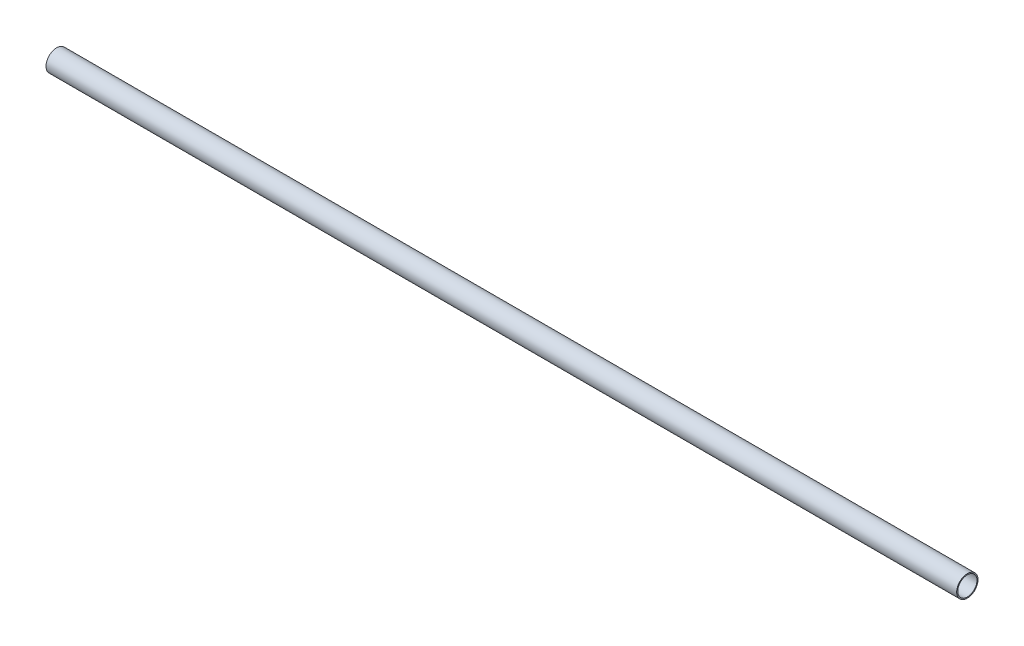
ISO-10303-21;
HEADER;
FILE_DESCRIPTION(('STEP AP214'),'2;1');
FILE_NAME('part.step','',(''),(''),'','','');
FILE_SCHEMA(('AUTOMOTIVE_DESIGN { 1 0 10303 214 1 1 1 1 }'));
ENDSEC;
DATA;
#1=APPLICATION_CONTEXT('core data for automotive mechanical design processes');
#2=APPLICATION_PROTOCOL_DEFINITION('international standard','automotive_design',2000,#1);
#3=PRODUCT_CONTEXT('',#1,'mechanical');
#4=PRODUCT('Part','Part','',(#3));
#5=PRODUCT_RELATED_PRODUCT_CATEGORY('part','',(#4));
#6=PRODUCT_DEFINITION_FORMATION('','',#4);
#7=PRODUCT_DEFINITION_CONTEXT('part definition',#1,'design');
#8=PRODUCT_DEFINITION('design','',#6,#7);
#9=PRODUCT_DEFINITION_SHAPE('','',#8);
#10=(LENGTH_UNIT() NAMED_UNIT(*) SI_UNIT(.MILLI.,.METRE.));
#11=(NAMED_UNIT(*) PLANE_ANGLE_UNIT() SI_UNIT($,.RADIAN.));
#12=(NAMED_UNIT(*) SI_UNIT($,.STERADIAN.) SOLID_ANGLE_UNIT());
#13=UNCERTAINTY_MEASURE_WITH_UNIT(LENGTH_MEASURE(1.E-05),#10,'distance_accuracy_value','');
#14=(GEOMETRIC_REPRESENTATION_CONTEXT(3) GLOBAL_UNCERTAINTY_ASSIGNED_CONTEXT((#13)) GLOBAL_UNIT_ASSIGNED_CONTEXT((#10,
#11,#12)) REPRESENTATION_CONTEXT('',''));
#15=CARTESIAN_POINT('',(0.,0.,0.));
#16=DIRECTION('',(0.,0.,1.));
#17=DIRECTION('',(1.,0.,0.));
#18=AXIS2_PLACEMENT_3D('',#15,#16,#17);
#19=CARTESIAN_POINT('',(20.,15.,0.));
#20=DIRECTION('',(1.,0.,0.));
#21=DIRECTION('',(0.,0.,-1.));
#22=AXIS2_PLACEMENT_3D('',#19,#20,#21);
#23=PLANE('',#22);
#24=CARTESIAN_POINT('',(20.,0.,0.));
#25=DIRECTION('',(-1.,0.,0.));
#26=DIRECTION('',(0.,0.,1.));
#27=AXIS2_PLACEMENT_3D('',#24,#25,#26);
#28=CIRCLE('',#27,13.5);
#29=CARTESIAN_POINT('',(20.,0.,13.5));
#30=VERTEX_POINT('',#29);
#31=EDGE_CURVE('E10',#30,#30,#28,.T.);
#32=ORIENTED_EDGE('',*,*,#31,.F.);
#33=EDGE_LOOP('',(#32));
#34=FACE_BOUND('',#33,.T.);
#35=CARTESIAN_POINT('',(20.,0.,0.));
#36=DIRECTION('',(-1.,0.,0.));
#37=DIRECTION('',(0.,0.,1.));
#38=AXIS2_PLACEMENT_3D('',#35,#36,#37);
#39=CIRCLE('',#38,15.);
#40=CARTESIAN_POINT('',(20.,0.,15.));
#41=VERTEX_POINT('',#40);
#42=EDGE_CURVE('E52',#41,#41,#39,.T.);
#43=ORIENTED_EDGE('',*,*,#42,.T.);
#44=EDGE_LOOP('',(#43));
#45=FACE_BOUND('',#44,.T.);
#46=ADVANCED_FACE('F39',(#34,#45),#23,.F.);
#47=CARTESIAN_POINT('',(-3000.,0.,0.));
#48=DIRECTION('',(-1.,0.,0.));
#49=DIRECTION('',(0.,0.,1.));
#50=AXIS2_PLACEMENT_3D('',#47,#48,#49);
#51=CYLINDRICAL_SURFACE('',#50,13.5);
#52=CARTESIAN_POINT('',(1300.,0.,0.));
#53=DIRECTION('',(-1.,0.,0.));
#54=DIRECTION('',(0.,0.,1.));
#55=AXIS2_PLACEMENT_3D('',#52,#53,#54);
#56=CIRCLE('',#55,13.5);
#57=CARTESIAN_POINT('',(1300.,0.,13.5));
#58=VERTEX_POINT('',#57);
#59=EDGE_CURVE('E44',#58,#58,#56,.T.);
#60=ORIENTED_EDGE('',*,*,#59,.F.);
#61=EDGE_LOOP('',(#60));
#62=FACE_BOUND('',#61,.T.);
#63=ORIENTED_EDGE('',*,*,#31,.T.);
#64=EDGE_LOOP('',(#63));
#65=FACE_BOUND('',#64,.T.);
#66=ADVANCED_FACE('F66',(#62,#65),#51,.F.);
#67=CARTESIAN_POINT('',(1300.,13.5,0.));
#68=DIRECTION('',(-1.,0.,0.));
#69=DIRECTION('',(0.,0.,1.));
#70=AXIS2_PLACEMENT_3D('',#67,#68,#69);
#71=PLANE('',#70);
#72=CARTESIAN_POINT('',(1300.,0.,0.));
#73=DIRECTION('',(-1.,0.,0.));
#74=DIRECTION('',(0.,0.,1.));
#75=AXIS2_PLACEMENT_3D('',#72,#73,#74);
#76=CIRCLE('',#75,15.);
#77=CARTESIAN_POINT('',(1300.,0.,15.));
#78=VERTEX_POINT('',#77);
#79=EDGE_CURVE('E47',#78,#78,#76,.T.);
#80=ORIENTED_EDGE('',*,*,#79,.F.);
#81=EDGE_LOOP('',(#80));
#82=FACE_BOUND('',#81,.T.);
#83=ORIENTED_EDGE('',*,*,#59,.T.);
#84=EDGE_LOOP('',(#83));
#85=FACE_BOUND('',#84,.T.);
#86=ADVANCED_FACE('F63',(#82,#85),#71,.F.);
#87=CARTESIAN_POINT('',(-3000.,0.,0.));
#88=DIRECTION('',(-1.,0.,0.));
#89=DIRECTION('',(0.,0.,1.));
#90=AXIS2_PLACEMENT_3D('',#87,#88,#89);
#91=CYLINDRICAL_SURFACE('',#90,15.);
#92=ORIENTED_EDGE('',*,*,#42,.F.);
#93=EDGE_LOOP('',(#92));
#94=FACE_BOUND('',#93,.T.);
#95=ORIENTED_EDGE('',*,*,#79,.T.);
#96=EDGE_LOOP('',(#95));
#97=FACE_BOUND('',#96,.T.);
#98=ADVANCED_FACE('F58',(#94,#97),#91,.T.);
#99=CLOSED_SHELL('',(#46,#66,#86,#98));
#100=MANIFOLD_SOLID_BREP('B2',#99);
#101=ADVANCED_BREP_SHAPE_REPRESENTATION('',(#18,#100),#14);
#102=SHAPE_DEFINITION_REPRESENTATION(#9,#101);
ENDSEC;
END-ISO-10303-21;
